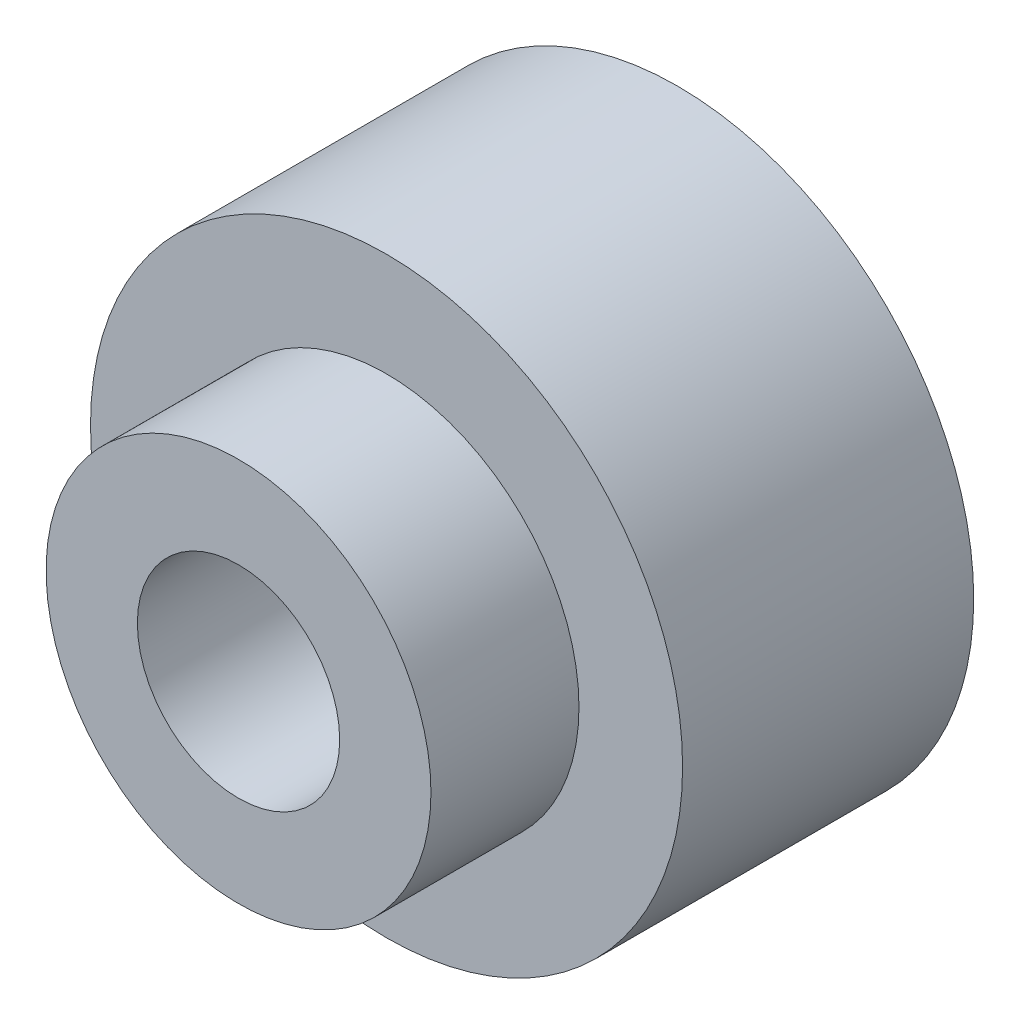
ISO-10303-21;
HEADER;
FILE_DESCRIPTION(('STEP AP214'),'2;1');
FILE_NAME('part.step','',(''),(''),'','','');
FILE_SCHEMA(('AUTOMOTIVE_DESIGN { 1 0 10303 214 1 1 1 1 }'));
ENDSEC;
DATA;
#1=APPLICATION_CONTEXT('core data for automotive mechanical design processes');
#2=APPLICATION_PROTOCOL_DEFINITION('international standard','automotive_design',2000,#1);
#3=PRODUCT_CONTEXT('',#1,'mechanical');
#4=PRODUCT('Part','Part','',(#3));
#5=PRODUCT_RELATED_PRODUCT_CATEGORY('part','',(#4));
#6=PRODUCT_DEFINITION_FORMATION('','',#4);
#7=PRODUCT_DEFINITION_CONTEXT('part definition',#1,'design');
#8=PRODUCT_DEFINITION('design','',#6,#7);
#9=PRODUCT_DEFINITION_SHAPE('','',#8);
#10=(LENGTH_UNIT() NAMED_UNIT(*) SI_UNIT(.MILLI.,.METRE.));
#11=(NAMED_UNIT(*) PLANE_ANGLE_UNIT() SI_UNIT($,.RADIAN.));
#12=(NAMED_UNIT(*) SI_UNIT($,.STERADIAN.) SOLID_ANGLE_UNIT());
#13=UNCERTAINTY_MEASURE_WITH_UNIT(LENGTH_MEASURE(1.E-05),#10,'distance_accuracy_value','');
#14=(GEOMETRIC_REPRESENTATION_CONTEXT(3) GLOBAL_UNCERTAINTY_ASSIGNED_CONTEXT((#13)) GLOBAL_UNIT_ASSIGNED_CONTEXT((#10,
#11,#12)) REPRESENTATION_CONTEXT('',''));
#15=CARTESIAN_POINT('',(0.,0.,0.));
#16=DIRECTION('',(0.,0.,1.));
#17=DIRECTION('',(1.,0.,0.));
#18=AXIS2_PLACEMENT_3D('',#15,#16,#17);
#19=CARTESIAN_POINT('',(0.,0.,5.9));
#20=DIRECTION('',(0.,0.,1.));
#21=DIRECTION('',(1.,0.,0.));
#22=AXIS2_PLACEMENT_3D('',#19,#20,#21);
#23=PLANE('',#22);
#24=CARTESIAN_POINT('',(0.,0.,5.9));
#25=DIRECTION('',(0.,0.,1.));
#26=DIRECTION('',(1.,0.,0.));
#27=AXIS2_PLACEMENT_3D('',#24,#25,#26);
#28=CIRCLE('',#27,6.);
#29=CARTESIAN_POINT('',(6.,0.,5.9));
#30=VERTEX_POINT('',#29);
#31=EDGE_CURVE('E10',#30,#30,#28,.T.);
#32=ORIENTED_EDGE('',*,*,#31,.T.);
#33=EDGE_LOOP('',(#32));
#34=FACE_BOUND('',#33,.T.);
#35=CARTESIAN_POINT('',(0.,0.,5.9));
#36=DIRECTION('',(0.,0.,1.));
#37=DIRECTION('',(1.,0.,0.));
#38=AXIS2_PLACEMENT_3D('',#35,#36,#37);
#39=CIRCLE('',#38,3.9);
#40=CARTESIAN_POINT('',(3.9,0.,5.9));
#41=VERTEX_POINT('',#40);
#42=EDGE_CURVE('E46',#41,#41,#39,.T.);
#43=ORIENTED_EDGE('',*,*,#42,.F.);
#44=EDGE_LOOP('',(#43));
#45=FACE_BOUND('',#44,.T.);
#46=ADVANCED_FACE('F30',(#34,#45),#23,.T.);
#47=CARTESIAN_POINT('',(0.,0.,0.));
#48=DIRECTION('',(0.,0.,1.));
#49=DIRECTION('',(1.,0.,0.));
#50=AXIS2_PLACEMENT_3D('',#47,#48,#49);
#51=PLANE('',#50);
#52=CARTESIAN_POINT('',(0.,0.,0.));
#53=DIRECTION('',(0.,0.,1.));
#54=DIRECTION('',(1.,0.,0.));
#55=AXIS2_PLACEMENT_3D('',#52,#53,#54);
#56=CIRCLE('',#55,6.);
#57=CARTESIAN_POINT('',(6.,0.,0.));
#58=VERTEX_POINT('',#57);
#59=EDGE_CURVE('E34',#58,#58,#56,.T.);
#60=ORIENTED_EDGE('',*,*,#59,.F.);
#61=EDGE_LOOP('',(#60));
#62=FACE_BOUND('',#61,.T.);
#63=CARTESIAN_POINT('',(0.,0.,0.));
#64=DIRECTION('',(0.,0.,1.));
#65=DIRECTION('',(1.,0.,0.));
#66=AXIS2_PLACEMENT_3D('',#63,#64,#65);
#67=CIRCLE('',#66,2.05);
#68=CARTESIAN_POINT('',(2.05,0.,0.));
#69=VERTEX_POINT('',#68);
#70=EDGE_CURVE('E41',#69,#69,#67,.T.);
#71=ORIENTED_EDGE('',*,*,#70,.T.);
#72=EDGE_LOOP('',(#71));
#73=FACE_BOUND('',#72,.T.);
#74=ADVANCED_FACE('F71',(#62,#73),#51,.F.);
#75=CARTESIAN_POINT('',(0.,0.,5.9));
#76=DIRECTION('',(0.,0.,-1.));
#77=DIRECTION('',(-1.,0.,0.));
#78=AXIS2_PLACEMENT_3D('',#75,#76,#77);
#79=CYLINDRICAL_SURFACE('',#78,6.);
#80=ORIENTED_EDGE('',*,*,#31,.F.);
#81=EDGE_LOOP('',(#80));
#82=FACE_BOUND('',#81,.T.);
#83=ORIENTED_EDGE('',*,*,#59,.T.);
#84=EDGE_LOOP('',(#83));
#85=FACE_BOUND('',#84,.T.);
#86=ADVANCED_FACE('F32',(#82,#85),#79,.T.);
#87=CARTESIAN_POINT('',(0.,0.,5.9));
#88=DIRECTION('',(0.,0.,-1.));
#89=DIRECTION('',(-1.,0.,0.));
#90=AXIS2_PLACEMENT_3D('',#87,#88,#89);
#91=CYLINDRICAL_SURFACE('',#90,2.05);
#92=ORIENTED_EDGE('',*,*,#70,.F.);
#93=EDGE_LOOP('',(#92));
#94=FACE_BOUND('',#93,.T.);
#95=CARTESIAN_POINT('',(0.,0.,8.9));
#96=DIRECTION('',(0.,0.,1.));
#97=DIRECTION('',(1.,0.,0.));
#98=AXIS2_PLACEMENT_3D('',#95,#96,#97);
#99=CIRCLE('',#98,2.05);
#100=CARTESIAN_POINT('',(2.05,0.,8.9));
#101=VERTEX_POINT('',#100);
#102=EDGE_CURVE('E49',#101,#101,#99,.T.);
#103=ORIENTED_EDGE('',*,*,#102,.T.);
#104=EDGE_LOOP('',(#103));
#105=FACE_BOUND('',#104,.T.);
#106=ADVANCED_FACE('F55',(#94,#105),#91,.F.);
#107=CARTESIAN_POINT('',(0.,0.,8.9));
#108=DIRECTION('',(0.,0.,1.));
#109=DIRECTION('',(1.,0.,0.));
#110=AXIS2_PLACEMENT_3D('',#107,#108,#109);
#111=PLANE('',#110);
#112=CARTESIAN_POINT('',(0.,0.,8.9));
#113=DIRECTION('',(0.,0.,1.));
#114=DIRECTION('',(1.,0.,0.));
#115=AXIS2_PLACEMENT_3D('',#112,#113,#114);
#116=CIRCLE('',#115,3.9);
#117=CARTESIAN_POINT('',(3.9,0.,8.9));
#118=VERTEX_POINT('',#117);
#119=EDGE_CURVE('E45',#118,#118,#116,.T.);
#120=ORIENTED_EDGE('',*,*,#119,.T.);
#121=EDGE_LOOP('',(#120));
#122=FACE_BOUND('',#121,.T.);
#123=ORIENTED_EDGE('',*,*,#102,.F.);
#124=EDGE_LOOP('',(#123));
#125=FACE_BOUND('',#124,.T.);
#126=ADVANCED_FACE('F57',(#122,#125),#111,.T.);
#127=CARTESIAN_POINT('',(0.,0.,8.9));
#128=DIRECTION('',(0.,0.,-1.));
#129=DIRECTION('',(-1.,0.,0.));
#130=AXIS2_PLACEMENT_3D('',#127,#128,#129);
#131=CYLINDRICAL_SURFACE('',#130,3.9);
#132=ORIENTED_EDGE('',*,*,#119,.F.);
#133=EDGE_LOOP('',(#132));
#134=FACE_BOUND('',#133,.T.);
#135=ORIENTED_EDGE('',*,*,#42,.T.);
#136=EDGE_LOOP('',(#135));
#137=FACE_BOUND('',#136,.T.);
#138=ADVANCED_FACE('F59',(#134,#137),#131,.T.);
#139=CLOSED_SHELL('',(#46,#74,#86,#106,#126,#138));
#140=MANIFOLD_SOLID_BREP('B2',#139);
#141=ADVANCED_BREP_SHAPE_REPRESENTATION('',(#18,#140),#14);
#142=SHAPE_DEFINITION_REPRESENTATION(#9,#141);
ENDSEC;
END-ISO-10303-21;
